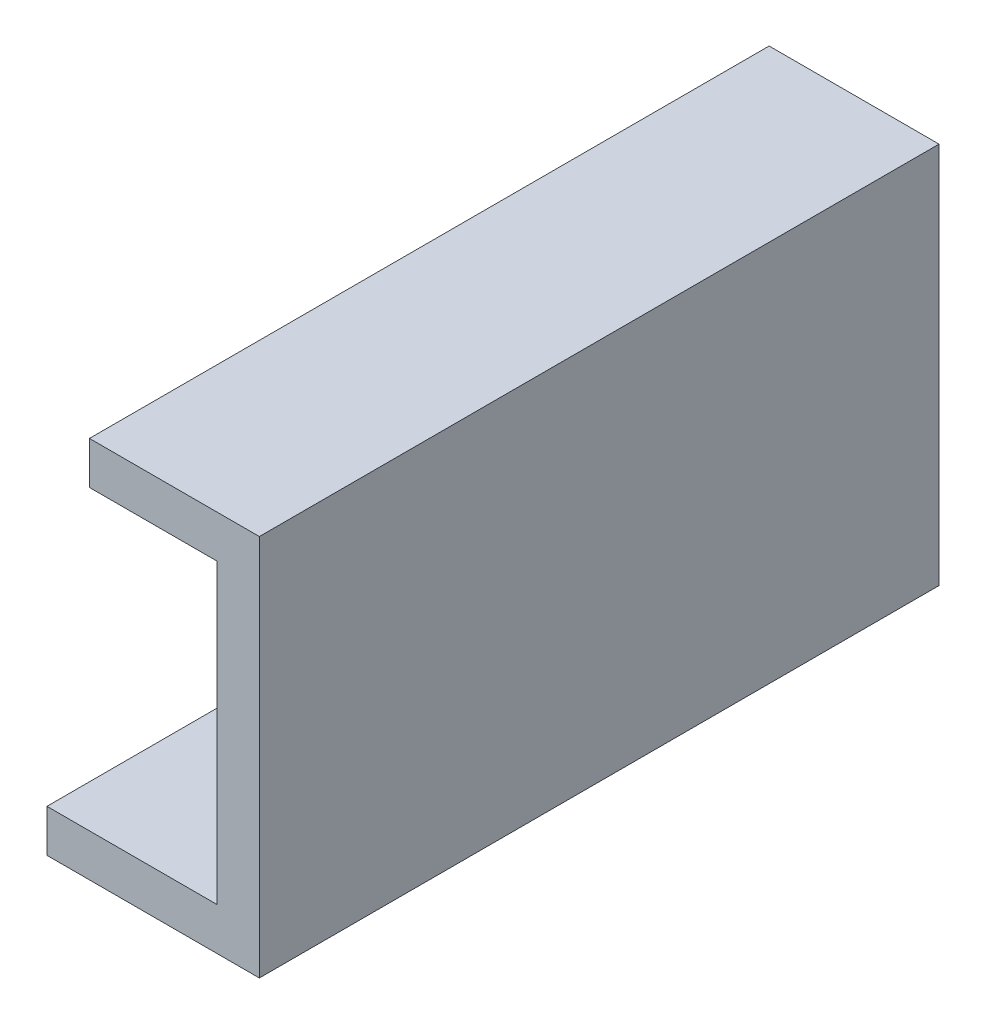
ISO-10303-21;
HEADER;
FILE_DESCRIPTION(('STEP AP214'),'2;1');
FILE_NAME('part.step','',(''),(''),'','','');
FILE_SCHEMA(('AUTOMOTIVE_DESIGN { 1 0 10303 214 1 1 1 1 }'));
ENDSEC;
DATA;
#1=APPLICATION_CONTEXT('core data for automotive mechanical design processes');
#2=APPLICATION_PROTOCOL_DEFINITION('international standard','automotive_design',2000,#1);
#3=PRODUCT_CONTEXT('',#1,'mechanical');
#4=PRODUCT('Part','Part','',(#3));
#5=PRODUCT_RELATED_PRODUCT_CATEGORY('part','',(#4));
#6=PRODUCT_DEFINITION_FORMATION('','',#4);
#7=PRODUCT_DEFINITION_CONTEXT('part definition',#1,'design');
#8=PRODUCT_DEFINITION('design','',#6,#7);
#9=PRODUCT_DEFINITION_SHAPE('','',#8);
#10=(LENGTH_UNIT() NAMED_UNIT(*) SI_UNIT(.MILLI.,.METRE.));
#11=(NAMED_UNIT(*) PLANE_ANGLE_UNIT() SI_UNIT($,.RADIAN.));
#12=(NAMED_UNIT(*) SI_UNIT($,.STERADIAN.) SOLID_ANGLE_UNIT());
#13=UNCERTAINTY_MEASURE_WITH_UNIT(LENGTH_MEASURE(1.E-05),#10,'distance_accuracy_value','');
#14=(GEOMETRIC_REPRESENTATION_CONTEXT(3) GLOBAL_UNCERTAINTY_ASSIGNED_CONTEXT((#13)) GLOBAL_UNIT_ASSIGNED_CONTEXT((#10,
#11,#12)) REPRESENTATION_CONTEXT('',''));
#15=CARTESIAN_POINT('',(0.,0.,0.));
#16=DIRECTION('',(0.,0.,1.));
#17=DIRECTION('',(1.,0.,0.));
#18=AXIS2_PLACEMENT_3D('',#15,#16,#17);
#19=CARTESIAN_POINT('',(0.675,0.175,-0.4));
#20=DIRECTION('',(0.,-1.,0.));
#21=DIRECTION('',(1.,0.,0.));
#22=AXIS2_PLACEMENT_3D('',#19,#20,#21);
#23=PLANE('',#22);
#24=DIRECTION('',(1.,0.,0.));
#25=VECTOR('',#24,1.);
#26=CARTESIAN_POINT('',(0.717647058824,0.175,-0.4));
#27=LINE('',#26,#25);
#28=CARTESIAN_POINT('',(0.6,0.175,-0.4));
#29=VERTEX_POINT('',#28);
#30=CARTESIAN_POINT('',(0.75,0.175,-0.4));
#31=VERTEX_POINT('',#30);
#32=EDGE_CURVE('E120',#29,#31,#27,.T.);
#33=ORIENTED_EDGE('',*,*,#32,.T.);
#34=DIRECTION('',(0.,0.,1.));
#35=VECTOR('',#34,1.);
#36=CARTESIAN_POINT('',(0.75,0.175,-0.4));
#37=LINE('',#36,#35);
#38=CARTESIAN_POINT('',(0.75,0.175,0.4));
#39=VERTEX_POINT('',#38);
#40=EDGE_CURVE('E20',#39,#31,#37,.F.);
#41=ORIENTED_EDGE('',*,*,#40,.F.);
#42=DIRECTION('',(1.,0.,0.));
#43=VECTOR('',#42,1.);
#44=CARTESIAN_POINT('',(0.717647058824,0.175,0.4));
#45=LINE('',#44,#43);
#46=CARTESIAN_POINT('',(0.6,0.175,0.4));
#47=VERTEX_POINT('',#46);
#48=EDGE_CURVE('E134',#47,#39,#45,.T.);
#49=ORIENTED_EDGE('',*,*,#48,.F.);
#50=DIRECTION('',(0.,0.,1.));
#51=VECTOR('',#50,1.);
#52=CARTESIAN_POINT('',(0.6,0.175,-0.4));
#53=LINE('',#52,#51);
#54=EDGE_CURVE('E94',#29,#47,#53,.T.);
#55=ORIENTED_EDGE('',*,*,#54,.F.);
#56=EDGE_LOOP('',(#33,#41,#49,#55));
#57=FACE_BOUND('',#56,.T.);
#58=ADVANCED_FACE('F17',(#57),#23,.T.);
#59=CARTESIAN_POINT('',(0.75,0.,-0.4));
#60=DIRECTION('',(-1.,0.,0.));
#61=DIRECTION('',(0.,0.,1.));
#62=AXIS2_PLACEMENT_3D('',#59,#60,#61);
#63=PLANE('',#62);
#64=DIRECTION('',(0.,1.,0.));
#65=VECTOR('',#64,1.);
#66=CARTESIAN_POINT('',(0.75,-0.01176470588235,-0.4));
#67=LINE('',#66,#65);
#68=CARTESIAN_POINT('',(0.75,-0.175,-0.4));
#69=VERTEX_POINT('',#68);
#70=EDGE_CURVE('E114',#31,#69,#67,.F.);
#71=ORIENTED_EDGE('',*,*,#70,.T.);
#72=DIRECTION('',(0.,0.,1.));
#73=VECTOR('',#72,1.);
#74=CARTESIAN_POINT('',(0.75,-0.175,-0.4));
#75=LINE('',#74,#73);
#76=CARTESIAN_POINT('',(0.75,-0.175,0.4));
#77=VERTEX_POINT('',#76);
#78=EDGE_CURVE('E79',#77,#69,#75,.F.);
#79=ORIENTED_EDGE('',*,*,#78,.F.);
#80=DIRECTION('',(0.,1.,0.));
#81=VECTOR('',#80,1.);
#82=CARTESIAN_POINT('',(0.75,-0.01176470588235,0.4));
#83=LINE('',#82,#81);
#84=EDGE_CURVE('E107',#39,#77,#83,.F.);
#85=ORIENTED_EDGE('',*,*,#84,.F.);
#86=ORIENTED_EDGE('',*,*,#40,.T.);
#87=EDGE_LOOP('',(#71,#79,#85,#86));
#88=FACE_BOUND('',#87,.T.);
#89=ADVANCED_FACE('F113',(#88),#63,.T.);
#90=CARTESIAN_POINT('',(0.65,-0.175,-0.4));
#91=DIRECTION('',(0.,1.,0.));
#92=DIRECTION('',(-1.,0.,0.));
#93=AXIS2_PLACEMENT_3D('',#90,#91,#92);
#94=PLANE('',#93);
#95=DIRECTION('',(1.,0.,0.));
#96=VECTOR('',#95,1.);
#97=CARTESIAN_POINT('',(0.717647058824,-0.175,-0.4));
#98=LINE('',#97,#96);
#99=CARTESIAN_POINT('',(0.55,-0.175,-0.4));
#100=VERTEX_POINT('',#99);
#101=EDGE_CURVE('E91',#69,#100,#98,.F.);
#102=ORIENTED_EDGE('',*,*,#101,.T.);
#103=DIRECTION('',(0.,0.,1.));
#104=VECTOR('',#103,1.);
#105=CARTESIAN_POINT('',(0.55,-0.175,-0.4));
#106=LINE('',#105,#104);
#107=CARTESIAN_POINT('',(0.55,-0.175,0.4));
#108=VERTEX_POINT('',#107);
#109=EDGE_CURVE('E84',#108,#100,#106,.F.);
#110=ORIENTED_EDGE('',*,*,#109,.F.);
#111=DIRECTION('',(1.,0.,0.));
#112=VECTOR('',#111,1.);
#113=CARTESIAN_POINT('',(0.717647058824,-0.175,0.4));
#114=LINE('',#113,#112);
#115=EDGE_CURVE('E88',#77,#108,#114,.F.);
#116=ORIENTED_EDGE('',*,*,#115,.F.);
#117=ORIENTED_EDGE('',*,*,#78,.T.);
#118=EDGE_LOOP('',(#102,#110,#116,#117));
#119=FACE_BOUND('',#118,.T.);
#120=ADVANCED_FACE('F86',(#119),#94,.T.);
#121=CARTESIAN_POINT('',(0.55,-0.2,-0.4));
#122=DIRECTION('',(-1.,0.,0.));
#123=DIRECTION('',(0.,0.,1.));
#124=AXIS2_PLACEMENT_3D('',#121,#122,#123);
#125=PLANE('',#124);
#126=DIRECTION('',(0.,1.,0.));
#127=VECTOR('',#126,1.);
#128=CARTESIAN_POINT('',(0.55,-0.01176470588235,-0.4));
#129=LINE('',#128,#127);
#130=CARTESIAN_POINT('',(0.55,-0.225,-0.4));
#131=VERTEX_POINT('',#130);
#132=EDGE_CURVE('E122',#100,#131,#129,.F.);
#133=ORIENTED_EDGE('',*,*,#132,.T.);
#134=DIRECTION('',(0.,0.,1.));
#135=VECTOR('',#134,1.);
#136=CARTESIAN_POINT('',(0.55,-0.225,-0.4));
#137=LINE('',#136,#135);
#138=CARTESIAN_POINT('',(0.55,-0.225,0.4));
#139=VERTEX_POINT('',#138);
#140=EDGE_CURVE('E100',#139,#131,#137,.F.);
#141=ORIENTED_EDGE('',*,*,#140,.F.);
#142=DIRECTION('',(0.,1.,0.));
#143=VECTOR('',#142,1.);
#144=CARTESIAN_POINT('',(0.55,-0.01176470588235,0.4));
#145=LINE('',#144,#143);
#146=EDGE_CURVE('E97',#108,#139,#145,.F.);
#147=ORIENTED_EDGE('',*,*,#146,.F.);
#148=ORIENTED_EDGE('',*,*,#109,.T.);
#149=EDGE_LOOP('',(#133,#141,#147,#148));
#150=FACE_BOUND('',#149,.T.);
#151=ADVANCED_FACE('F98',(#150),#125,.T.);
#152=CARTESIAN_POINT('',(0.6,0.2,-0.4));
#153=DIRECTION('',(-1.,0.,0.));
#154=DIRECTION('',(0.,0.,1.));
#155=AXIS2_PLACEMENT_3D('',#152,#153,#154);
#156=PLANE('',#155);
#157=DIRECTION('',(0.,1.,0.));
#158=VECTOR('',#157,1.);
#159=CARTESIAN_POINT('',(0.6,-0.01176470588235,-0.4));
#160=LINE('',#159,#158);
#161=CARTESIAN_POINT('',(0.6,0.225,-0.4));
#162=VERTEX_POINT('',#161);
#163=EDGE_CURVE('E124',#162,#29,#160,.F.);
#164=ORIENTED_EDGE('',*,*,#163,.T.);
#165=ORIENTED_EDGE('',*,*,#54,.T.);
#166=DIRECTION('',(0.,1.,0.));
#167=VECTOR('',#166,1.);
#168=CARTESIAN_POINT('',(0.6,-0.01176470588235,0.4));
#169=LINE('',#168,#167);
#170=CARTESIAN_POINT('',(0.6,0.225,0.4));
#171=VERTEX_POINT('',#170);
#172=EDGE_CURVE('E103',#171,#47,#169,.F.);
#173=ORIENTED_EDGE('',*,*,#172,.F.);
#174=DIRECTION('',(0.,0.,1.));
#175=VECTOR('',#174,1.);
#176=CARTESIAN_POINT('',(0.6,0.225,-0.4));
#177=LINE('',#176,#175);
#178=EDGE_CURVE('E143',#162,#171,#177,.T.);
#179=ORIENTED_EDGE('',*,*,#178,.F.);
#180=EDGE_LOOP('',(#164,#165,#173,#179));
#181=FACE_BOUND('',#180,.T.);
#182=ADVANCED_FACE('F142',(#181),#156,.T.);
#183=CARTESIAN_POINT('',(0.717647058824,-0.01176470588235,0.4));
#184=DIRECTION('',(0.,0.,1.));
#185=DIRECTION('',(1.,0.,0.));
#186=AXIS2_PLACEMENT_3D('',#183,#184,#185);
#187=PLANE('',#186);
#188=ORIENTED_EDGE('',*,*,#48,.T.);
#189=ORIENTED_EDGE('',*,*,#84,.T.);
#190=ORIENTED_EDGE('',*,*,#115,.T.);
#191=ORIENTED_EDGE('',*,*,#146,.T.);
#192=DIRECTION('',(1.,0.,0.));
#193=VECTOR('',#192,1.);
#194=CARTESIAN_POINT('',(0.675,-0.225,0.4));
#195=LINE('',#194,#193);
#196=CARTESIAN_POINT('',(0.8,-0.225,0.4));
#197=VERTEX_POINT('',#196);
#198=EDGE_CURVE('E131',#197,#139,#195,.F.);
#199=ORIENTED_EDGE('',*,*,#198,.F.);
#200=DIRECTION('',(0.,1.,0.));
#201=VECTOR('',#200,1.);
#202=CARTESIAN_POINT('',(0.8,0.,0.4));
#203=LINE('',#202,#201);
#204=CARTESIAN_POINT('',(0.8,0.225,0.4));
#205=VERTEX_POINT('',#204);
#206=EDGE_CURVE('E221',#205,#197,#203,.F.);
#207=ORIENTED_EDGE('',*,*,#206,.F.);
#208=DIRECTION('',(-1.,0.,0.));
#209=VECTOR('',#208,1.);
#210=CARTESIAN_POINT('',(0.7,0.225,0.4));
#211=LINE('',#210,#209);
#212=EDGE_CURVE('E138',#171,#205,#211,.F.);
#213=ORIENTED_EDGE('',*,*,#212,.F.);
#214=ORIENTED_EDGE('',*,*,#172,.T.);
#215=EDGE_LOOP('',(#188,#189,#190,#191,#199,#207,#213,#214));
#216=FACE_BOUND('',#215,.T.);
#217=ADVANCED_FACE('F106',(#216),#187,.T.);
#218=CARTESIAN_POINT('',(0.675,-0.225,-0.4));
#219=DIRECTION('',(0.,-1.,0.));
#220=DIRECTION('',(1.,0.,0.));
#221=AXIS2_PLACEMENT_3D('',#218,#219,#220);
#222=PLANE('',#221);
#223=DIRECTION('',(1.,0.,0.));
#224=VECTOR('',#223,1.);
#225=CARTESIAN_POINT('',(0.717647058824,-0.225,-0.4));
#226=LINE('',#225,#224);
#227=CARTESIAN_POINT('',(0.8,-0.225,-0.4));
#228=VERTEX_POINT('',#227);
#229=EDGE_CURVE('E215',#131,#228,#226,.T.);
#230=ORIENTED_EDGE('',*,*,#229,.T.);
#231=DIRECTION('',(0.,0.,-1.));
#232=VECTOR('',#231,1.);
#233=CARTESIAN_POINT('',(0.8,-0.225,-0.4));
#234=LINE('',#233,#232);
#235=EDGE_CURVE('E217',#197,#228,#234,.T.);
#236=ORIENTED_EDGE('',*,*,#235,.F.);
#237=ORIENTED_EDGE('',*,*,#198,.T.);
#238=ORIENTED_EDGE('',*,*,#140,.T.);
#239=EDGE_LOOP('',(#230,#236,#237,#238));
#240=FACE_BOUND('',#239,.T.);
#241=ADVANCED_FACE('F163',(#240),#222,.T.);
#242=CARTESIAN_POINT('',(0.717647058824,-0.01176470588235,-0.4));
#243=DIRECTION('',(0.,0.,1.));
#244=DIRECTION('',(1.,0.,0.));
#245=AXIS2_PLACEMENT_3D('',#242,#243,#244);
#246=PLANE('',#245);
#247=ORIENTED_EDGE('',*,*,#229,.F.);
#248=ORIENTED_EDGE('',*,*,#132,.F.);
#249=ORIENTED_EDGE('',*,*,#101,.F.);
#250=ORIENTED_EDGE('',*,*,#70,.F.);
#251=ORIENTED_EDGE('',*,*,#32,.F.);
#252=ORIENTED_EDGE('',*,*,#163,.F.);
#253=DIRECTION('',(-1.,0.,0.));
#254=VECTOR('',#253,1.);
#255=CARTESIAN_POINT('',(0.7,0.225,-0.4));
#256=LINE('',#255,#254);
#257=CARTESIAN_POINT('',(0.8,0.225,-0.4));
#258=VERTEX_POINT('',#257);
#259=EDGE_CURVE('E35',#258,#162,#256,.T.);
#260=ORIENTED_EDGE('',*,*,#259,.F.);
#261=DIRECTION('',(0.,1.,0.));
#262=VECTOR('',#261,1.);
#263=CARTESIAN_POINT('',(0.8,0.,-0.4));
#264=LINE('',#263,#262);
#265=EDGE_CURVE('E26',#228,#258,#264,.T.);
#266=ORIENTED_EDGE('',*,*,#265,.F.);
#267=EDGE_LOOP('',(#247,#248,#249,#250,#251,#252,#260,#266));
#268=FACE_BOUND('',#267,.T.);
#269=ADVANCED_FACE('F119',(#268),#246,.F.);
#270=CARTESIAN_POINT('',(0.7,0.225,-0.4));
#271=DIRECTION('',(0.,1.,0.));
#272=DIRECTION('',(-1.,0.,0.));
#273=AXIS2_PLACEMENT_3D('',#270,#271,#272);
#274=PLANE('',#273);
#275=ORIENTED_EDGE('',*,*,#259,.T.);
#276=ORIENTED_EDGE('',*,*,#178,.T.);
#277=ORIENTED_EDGE('',*,*,#212,.T.);
#278=DIRECTION('',(0.,0.,-1.));
#279=VECTOR('',#278,1.);
#280=CARTESIAN_POINT('',(0.8,0.225,-0.4));
#281=LINE('',#280,#279);
#282=EDGE_CURVE('E11',#258,#205,#281,.F.);
#283=ORIENTED_EDGE('',*,*,#282,.F.);
#284=EDGE_LOOP('',(#275,#276,#277,#283));
#285=FACE_BOUND('',#284,.T.);
#286=ADVANCED_FACE('F151',(#285),#274,.T.);
#287=CARTESIAN_POINT('',(0.8,0.,-0.4));
#288=DIRECTION('',(1.,0.,0.));
#289=DIRECTION('',(0.,0.,-1.));
#290=AXIS2_PLACEMENT_3D('',#287,#288,#289);
#291=PLANE('',#290);
#292=ORIENTED_EDGE('',*,*,#265,.T.);
#293=ORIENTED_EDGE('',*,*,#282,.T.);
#294=ORIENTED_EDGE('',*,*,#206,.T.);
#295=ORIENTED_EDGE('',*,*,#235,.T.);
#296=EDGE_LOOP('',(#292,#293,#294,#295));
#297=FACE_BOUND('',#296,.T.);
#298=ADVANCED_FACE('F149',(#297),#291,.T.);
#299=CLOSED_SHELL('',(#58,#89,#120,#151,#182,#217,#241,#269,#286,#298));
#300=MANIFOLD_SOLID_BREP('B1',#299);
#301=ADVANCED_BREP_SHAPE_REPRESENTATION('',(#18,#300),#14);
#302=SHAPE_DEFINITION_REPRESENTATION(#9,#301);
ENDSEC;
END-ISO-10303-21;
